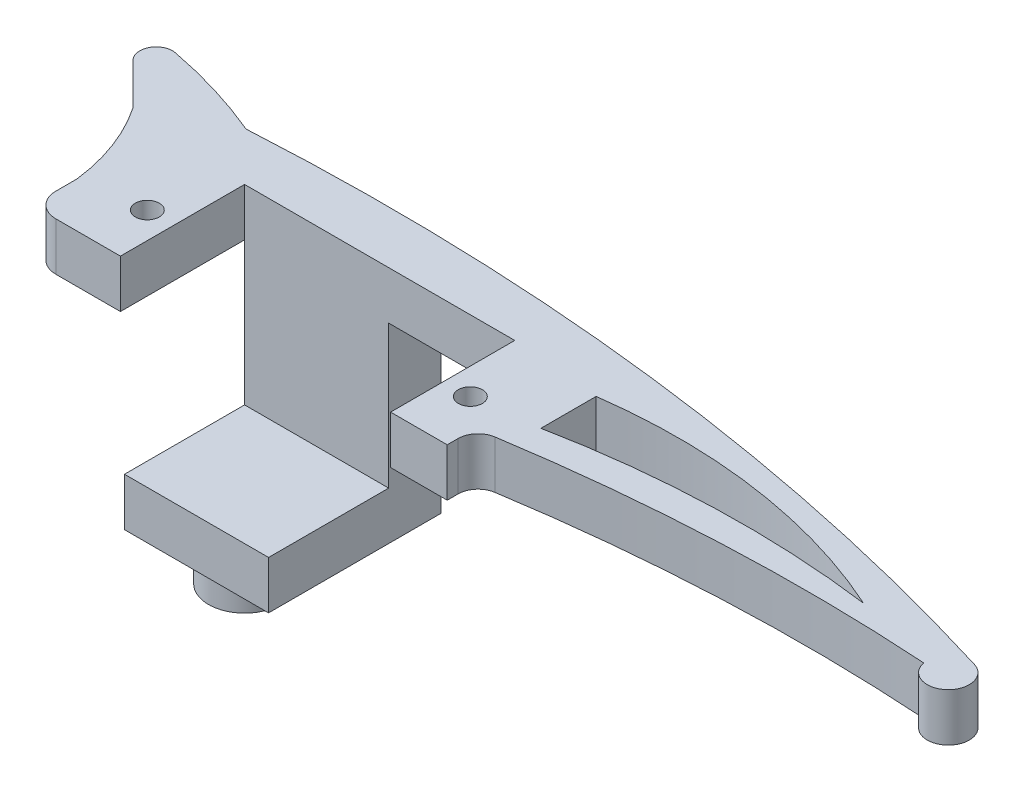
ISO-10303-21;
HEADER;
FILE_DESCRIPTION(('STEP AP214'),'2;1');
FILE_NAME('part.step','',(''),(''),'','','');
FILE_SCHEMA(('AUTOMOTIVE_DESIGN { 1 0 10303 214 1 1 1 1 }'));
ENDSEC;
DATA;
#1=APPLICATION_CONTEXT('core data for automotive mechanical design processes');
#2=APPLICATION_PROTOCOL_DEFINITION('international standard','automotive_design',2000,#1);
#3=PRODUCT_CONTEXT('',#1,'mechanical');
#4=PRODUCT('Part','Part','',(#3));
#5=PRODUCT_RELATED_PRODUCT_CATEGORY('part','',(#4));
#6=PRODUCT_DEFINITION_FORMATION('','',#4);
#7=PRODUCT_DEFINITION_CONTEXT('part definition',#1,'design');
#8=PRODUCT_DEFINITION('design','',#6,#7);
#9=PRODUCT_DEFINITION_SHAPE('','',#8);
#10=(LENGTH_UNIT() NAMED_UNIT(*) SI_UNIT(.MILLI.,.METRE.));
#11=(NAMED_UNIT(*) PLANE_ANGLE_UNIT() SI_UNIT($,.RADIAN.));
#12=(NAMED_UNIT(*) SI_UNIT($,.STERADIAN.) SOLID_ANGLE_UNIT());
#13=UNCERTAINTY_MEASURE_WITH_UNIT(LENGTH_MEASURE(1.E-05),#10,'distance_accuracy_value','');
#14=(GEOMETRIC_REPRESENTATION_CONTEXT(3) GLOBAL_UNCERTAINTY_ASSIGNED_CONTEXT((#13)) GLOBAL_UNIT_ASSIGNED_CONTEXT((#10,
#11,#12)) REPRESENTATION_CONTEXT('',''));
#15=CARTESIAN_POINT('',(0.,0.,0.));
#16=DIRECTION('',(0.,0.,1.));
#17=DIRECTION('',(1.,0.,0.));
#18=AXIS2_PLACEMENT_3D('',#15,#16,#17);
#19=CARTESIAN_POINT('',(14.,2.,-5.9));
#20=DIRECTION('',(0.,0.,-1.));
#21=DIRECTION('',(-1.,0.,0.));
#22=AXIS2_PLACEMENT_3D('',#19,#20,#21);
#23=PLANE('',#22);
#24=DIRECTION('',(-1.,0.,0.));
#25=VECTOR('',#24,1.);
#26=CARTESIAN_POINT('',(14.,-13.9,-5.9));
#27=LINE('',#26,#25);
#28=CARTESIAN_POINT('',(26.,-13.9,-5.9));
#29=VERTEX_POINT('',#28);
#30=CARTESIAN_POINT('',(14.,-13.9,-5.9));
#31=VERTEX_POINT('',#30);
#32=EDGE_CURVE('E235',#29,#31,#27,.T.);
#33=ORIENTED_EDGE('',*,*,#32,.F.);
#34=DIRECTION('',(0.,1.,0.));
#35=VECTOR('',#34,1.);
#36=CARTESIAN_POINT('',(26.,-17.9,-5.9));
#37=LINE('',#36,#35);
#38=CARTESIAN_POINT('',(26.,-2.,-5.9));
#39=VERTEX_POINT('',#38);
#40=EDGE_CURVE('E270',#29,#39,#37,.T.);
#41=ORIENTED_EDGE('',*,*,#40,.T.);
#42=DIRECTION('',(1.,0.,0.));
#43=VECTOR('',#42,1.);
#44=CARTESIAN_POINT('',(14.,-2.,-5.9));
#45=LINE('',#44,#43);
#46=CARTESIAN_POINT('',(36.5,-2.,-5.9));
#47=VERTEX_POINT('',#46);
#48=EDGE_CURVE('E379',#39,#47,#45,.T.);
#49=ORIENTED_EDGE('',*,*,#48,.T.);
#50=DIRECTION('',(0.,-1.,0.));
#51=VECTOR('',#50,1.);
#52=CARTESIAN_POINT('',(36.5,2.,-5.9));
#53=LINE('',#52,#51);
#54=CARTESIAN_POINT('',(36.5,2.,-5.9));
#55=VERTEX_POINT('',#54);
#56=EDGE_CURVE('E48',#55,#47,#53,.T.);
#57=ORIENTED_EDGE('',*,*,#56,.F.);
#58=DIRECTION('',(1.,0.,0.));
#59=VECTOR('',#58,1.);
#60=CARTESIAN_POINT('',(14.,2.,-5.9));
#61=LINE('',#60,#59);
#62=CARTESIAN_POINT('',(14.,2.,-5.9));
#63=VERTEX_POINT('',#62);
#64=EDGE_CURVE('E329',#63,#55,#61,.T.);
#65=ORIENTED_EDGE('',*,*,#64,.F.);
#66=DIRECTION('',(0.,-1.,0.));
#67=VECTOR('',#66,1.);
#68=CARTESIAN_POINT('',(14.,2.,-5.9));
#69=LINE('',#68,#67);
#70=CARTESIAN_POINT('',(14.,-2.,-5.9));
#71=VERTEX_POINT('',#70);
#72=EDGE_CURVE('E11',#63,#71,#69,.T.);
#73=ORIENTED_EDGE('',*,*,#72,.T.);
#74=DIRECTION('',(0.,1.,0.));
#75=VECTOR('',#74,1.);
#76=CARTESIAN_POINT('',(14.,-17.9,-5.9));
#77=LINE('',#76,#75);
#78=EDGE_CURVE('E267',#31,#71,#77,.T.);
#79=ORIENTED_EDGE('',*,*,#78,.F.);
#80=EDGE_LOOP('',(#33,#41,#49,#57,#65,#73,#79));
#81=FACE_BOUND('',#80,.T.);
#82=ADVANCED_FACE('F39',(#81),#23,.F.);
#83=CARTESIAN_POINT('',(8.62634024035574,-2.,2.4385181586324));
#84=DIRECTION('',(0.,-1.,0.));
#85=DIRECTION('',(0.,0.,-1.));
#86=AXIS2_PLACEMENT_3D('',#83,#84,#85);
#87=PLANE('',#86);
#88=DIRECTION('',(0.,0.,-1.));
#89=VECTOR('',#88,1.);
#90=CARTESIAN_POINT('',(14.,-2.,2.4385181586324));
#91=LINE('',#90,#89);
#92=CARTESIAN_POINT('',(14.,-2.,-10.1461044190017));
#93=VERTEX_POINT('',#92);
#94=EDGE_CURVE('E255',#71,#93,#91,.T.);
#95=ORIENTED_EDGE('',*,*,#94,.F.);
#96=DIRECTION('',(0.,0.,-1.));
#97=VECTOR('',#96,1.);
#98=CARTESIAN_POINT('',(14.,-2.,0.));
#99=LINE('',#98,#97);
#100=CARTESIAN_POINT('',(14.,-2.,4.4385181586324));
#101=VERTEX_POINT('',#100);
#102=EDGE_CURVE('E322',#101,#71,#99,.T.);
#103=ORIENTED_EDGE('',*,*,#102,.F.);
#104=DIRECTION('',(1.,0.,0.));
#105=VECTOR('',#104,1.);
#106=CARTESIAN_POINT('',(14.,-2.,4.4385181586324));
#107=LINE('',#106,#105);
#108=CARTESIAN_POINT('',(8.62634024035575,-2.,4.4385181586324));
#109=VERTEX_POINT('',#108);
#110=EDGE_CURVE('E330',#109,#101,#107,.T.);
#111=ORIENTED_EDGE('',*,*,#110,.F.);
#112=CARTESIAN_POINT('',(8.62634024035574,-2.,2.4385181586324));
#113=DIRECTION('',(0.,1.,0.));
#114=DIRECTION('',(0.,0.,-1.));
#115=AXIS2_PLACEMENT_3D('',#112,#113,#114);
#116=CIRCLE('',#115,2.);
#117=CARTESIAN_POINT('',(6.62634024035574,-2.,2.43851815863239));
#118=VERTEX_POINT('',#117);
#119=EDGE_CURVE('E418',#118,#109,#116,.T.);
#120=ORIENTED_EDGE('',*,*,#119,.F.);
#121=DIRECTION('',(0.,0.,1.));
#122=VECTOR('',#121,1.);
#123=CARTESIAN_POINT('',(6.62634024035574,-2.,2.43851815863239));
#124=LINE('',#123,#122);
#125=CARTESIAN_POINT('',(6.62634024035574,-2.,0.696918803145781));
#126=VERTEX_POINT('',#125);
#127=EDGE_CURVE('E415',#126,#118,#124,.T.);
#128=ORIENTED_EDGE('',*,*,#127,.F.);
#129=CARTESIAN_POINT('',(-10.1704841528173,-2.,2.72257085172816));
#130=DIRECTION('',(0.,-1.,0.));
#131=DIRECTION('',(0.,0.,-1.));
#132=AXIS2_PLACEMENT_3D('',#129,#130,#131);
#133=CIRCLE('',#132,16.9185275930566);
#134=CARTESIAN_POINT('',(3.82191689743255,-2.,-6.78791224672617));
#135=VERTEX_POINT('',#134);
#136=EDGE_CURVE('E412',#135,#126,#133,.T.);
#137=ORIENTED_EDGE('',*,*,#136,.F.);
#138=DIRECTION('',(0.707106781186548,0.,0.707106781186547));
#139=VECTOR('',#138,1.);
#140=CARTESIAN_POINT('',(0.399525233837649,-2.,-10.2103039103211));
#141=LINE('',#140,#139);
#142=CARTESIAN_POINT('',(0.399525233837648,-2.,-10.2103039103211));
#143=VERTEX_POINT('',#142);
#144=EDGE_CURVE('E409',#143,#135,#141,.T.);
#145=ORIENTED_EDGE('',*,*,#144,.F.);
#146=CARTESIAN_POINT('',(1.36406447187878,-2.,-11.1748431483622));
#147=DIRECTION('',(0.,1.,0.));
#148=DIRECTION('',(0.,0.,1.));
#149=AXIS2_PLACEMENT_3D('',#146,#147,#148);
#150=CIRCLE('',#149,1.36406447187879);
#151=CARTESIAN_POINT('',(1.62029316355011,-2.,-12.5146262431236));
#152=VERTEX_POINT('',#151);
#153=EDGE_CURVE('E406',#152,#143,#150,.T.);
#154=ORIENTED_EDGE('',*,*,#153,.F.);
#155=CARTESIAN_POINT('',(-6.28370304347102,-2.,28.8142367742464));
#156=DIRECTION('',(0.,1.,0.));
#157=DIRECTION('',(0.,0.,1.));
#158=AXIS2_PLACEMENT_3D('',#155,#156,#157);
#159=CIRCLE('',#158,42.0778810582132);
#160=CARTESIAN_POINT('',(10.0716883526537,-2.,-9.95494230693514));
#161=VERTEX_POINT('',#160);
#162=EDGE_CURVE('E403',#161,#152,#159,.T.);
#163=ORIENTED_EDGE('',*,*,#162,.F.);
#164=CARTESIAN_POINT('',(21.5542197661014,-2.,185.548621723486));
#165=DIRECTION('',(0.,1.,0.));
#166=DIRECTION('',(0.,0.,1.));
#167=AXIS2_PLACEMENT_3D('',#164,#165,#166);
#168=CIRCLE('',#167,195.840476092808);
#169=EDGE_CURVE('E55',#93,#161,#168,.T.);
#170=ORIENTED_EDGE('',*,*,#169,.F.);
#171=EDGE_LOOP('',(#95,#103,#111,#120,#128,#137,#145,#154,#163,#170));
#172=FACE_BOUND('',#171,.T.);
#173=CARTESIAN_POINT('',(11.8,-2.,0.));
#174=DIRECTION('',(0.,1.,0.));
#175=DIRECTION('',(0.,0.,1.));
#176=AXIS2_PLACEMENT_3D('',#173,#174,#175);
#177=CIRCLE('',#176,1.);
#178=CARTESIAN_POINT('',(11.8,-2.,1.));
#179=VERTEX_POINT('',#178);
#180=EDGE_CURVE('E314',#179,#179,#177,.T.);
#181=ORIENTED_EDGE('',*,*,#180,.T.);
#182=EDGE_LOOP('',(#181));
#183=FACE_BOUND('',#182,.T.);
#184=ADVANCED_FACE('F517',(#172,#183),#87,.T.);
#185=CARTESIAN_POINT('',(8.62634024035574,2.,2.4385181586324));
#186=DIRECTION('',(0.,-1.,0.));
#187=DIRECTION('',(0.,0.,-1.));
#188=AXIS2_PLACEMENT_3D('',#185,#186,#187);
#189=PLANE('',#188);
#190=CARTESIAN_POINT('',(38.7,2.,0.));
#191=DIRECTION('',(0.,1.,0.));
#192=DIRECTION('',(0.,0.,1.));
#193=AXIS2_PLACEMENT_3D('',#190,#191,#192);
#194=CIRCLE('',#193,0.999999999999998);
#195=CARTESIAN_POINT('',(38.7,2.,0.999999999999998));
#196=VERTEX_POINT('',#195);
#197=EDGE_CURVE('E310',#196,#196,#194,.T.);
#198=ORIENTED_EDGE('',*,*,#197,.F.);
#199=EDGE_LOOP('',(#198));
#200=FACE_BOUND('',#199,.T.);
#201=CARTESIAN_POINT('',(11.8,2.,0.));
#202=DIRECTION('',(0.,1.,0.));
#203=DIRECTION('',(0.,0.,1.));
#204=AXIS2_PLACEMENT_3D('',#201,#202,#203);
#205=CIRCLE('',#204,1.);
#206=CARTESIAN_POINT('',(11.8,2.,1.));
#207=VERTEX_POINT('',#206);
#208=EDGE_CURVE('E318',#207,#207,#205,.T.);
#209=ORIENTED_EDGE('',*,*,#208,.F.);
#210=EDGE_LOOP('',(#209));
#211=FACE_BOUND('',#210,.T.);
#212=DIRECTION('',(0.,0.,-1.));
#213=VECTOR('',#212,1.);
#214=CARTESIAN_POINT('',(14.,2.,0.));
#215=LINE('',#214,#213);
#216=CARTESIAN_POINT('',(14.,2.,4.4385181586324));
#217=VERTEX_POINT('',#216);
#218=EDGE_CURVE('E326',#217,#63,#215,.T.);
#219=ORIENTED_EDGE('',*,*,#218,.T.);
#220=ORIENTED_EDGE('',*,*,#64,.T.);
#221=DIRECTION('',(0.,0.,1.));
#222=VECTOR('',#221,1.);
#223=CARTESIAN_POINT('',(36.5,2.,-5.9));
#224=LINE('',#223,#222);
#225=CARTESIAN_POINT('',(36.5,2.,4.4385181586324));
#226=VERTEX_POINT('',#225);
#227=EDGE_CURVE('E333',#55,#226,#224,.T.);
#228=ORIENTED_EDGE('',*,*,#227,.T.);
#229=DIRECTION('',(1.,0.,0.));
#230=VECTOR('',#229,1.);
#231=CARTESIAN_POINT('',(36.5,2.,4.4385181586324));
#232=LINE('',#231,#230);
#233=CARTESIAN_POINT('',(41.2135196632889,2.,4.4385181586324));
#234=VERTEX_POINT('',#233);
#235=EDGE_CURVE('E336',#226,#234,#232,.T.);
#236=ORIENTED_EDGE('',*,*,#235,.T.);
#237=DIRECTION('',(0.,0.,-1.));
#238=VECTOR('',#237,1.);
#239=CARTESIAN_POINT('',(41.2135196632889,2.,4.4385181586324));
#240=LINE('',#239,#238);
#241=CARTESIAN_POINT('',(41.2135196632889,2.,3.53621429674051));
#242=VERTEX_POINT('',#241);
#243=EDGE_CURVE('E339',#234,#242,#240,.T.);
#244=ORIENTED_EDGE('',*,*,#243,.T.);
#245=CARTESIAN_POINT('',(42.8824091488573,2.,3.53621429674051));
#246=DIRECTION('',(0.,-1.,0.));
#247=DIRECTION('',(0.,0.,-1.));
#248=AXIS2_PLACEMENT_3D('',#245,#246,#247);
#249=CIRCLE('',#248,1.66888948556837);
#250=CARTESIAN_POINT('',(42.621822840626,2.,1.88779478369079));
#251=VERTEX_POINT('',#250);
#252=EDGE_CURVE('E342',#242,#251,#249,.T.);
#253=ORIENTED_EDGE('',*,*,#252,.T.);
#254=CARTESIAN_POINT('',(66.6949978674598,2.,154.170129663986));
#255=DIRECTION('',(0.,-1.,0.));
#256=DIRECTION('',(0.,0.,-1.));
#257=AXIS2_PLACEMENT_3D('',#254,#255,#256);
#258=CIRCLE('',#257,154.173367584895);
#259=CARTESIAN_POINT('',(76.7808257933976,2.,0.32701689154066));
#260=VERTEX_POINT('',#259);
#261=EDGE_CURVE('E345',#251,#260,#258,.T.);
#262=ORIENTED_EDGE('',*,*,#261,.T.);
#263=CARTESIAN_POINT('',(78.5,2.,0.));
#264=DIRECTION('',(0.,1.,0.));
#265=DIRECTION('',(0.,0.,1.));
#266=AXIS2_PLACEMENT_3D('',#263,#264,#265);
#267=CIRCLE('',#266,1.75);
#268=CARTESIAN_POINT('',(79.0134467049361,2.,-1.67298310845934));
#269=VERTEX_POINT('',#268);
#270=EDGE_CURVE('E348',#260,#269,#267,.T.);
#271=ORIENTED_EDGE('',*,*,#270,.T.);
#272=CARTESIAN_POINT('',(21.5542197661014,2.,185.548621723486));
#273=DIRECTION('',(0.,1.,0.));
#274=DIRECTION('',(0.,0.,1.));
#275=AXIS2_PLACEMENT_3D('',#272,#273,#274);
#276=CIRCLE('',#275,195.840476092808);
#277=CARTESIAN_POINT('',(10.0716883526537,2.,-9.95494230693514));
#278=VERTEX_POINT('',#277);
#279=EDGE_CURVE('E351',#269,#278,#276,.T.);
#280=ORIENTED_EDGE('',*,*,#279,.T.);
#281=CARTESIAN_POINT('',(-6.28370304347102,2.,28.8142367742464));
#282=DIRECTION('',(0.,1.,0.));
#283=DIRECTION('',(0.,0.,1.));
#284=AXIS2_PLACEMENT_3D('',#281,#282,#283);
#285=CIRCLE('',#284,42.0778810582132);
#286=CARTESIAN_POINT('',(1.62029316355011,2.,-12.5146262431236));
#287=VERTEX_POINT('',#286);
#288=EDGE_CURVE('E354',#278,#287,#285,.T.);
#289=ORIENTED_EDGE('',*,*,#288,.T.);
#290=CARTESIAN_POINT('',(1.36406447187878,2.,-11.1748431483622));
#291=DIRECTION('',(0.,1.,0.));
#292=DIRECTION('',(0.,0.,1.));
#293=AXIS2_PLACEMENT_3D('',#290,#291,#292);
#294=CIRCLE('',#293,1.36406447187879);
#295=CARTESIAN_POINT('',(0.399525233837648,2.,-10.2103039103211));
#296=VERTEX_POINT('',#295);
#297=EDGE_CURVE('E357',#287,#296,#294,.T.);
#298=ORIENTED_EDGE('',*,*,#297,.T.);
#299=DIRECTION('',(0.707106781186548,0.,0.707106781186547));
#300=VECTOR('',#299,1.);
#301=CARTESIAN_POINT('',(0.399525233837649,2.,-10.2103039103211));
#302=LINE('',#301,#300);
#303=CARTESIAN_POINT('',(3.82191689743255,2.,-6.78791224672617));
#304=VERTEX_POINT('',#303);
#305=EDGE_CURVE('E360',#296,#304,#302,.T.);
#306=ORIENTED_EDGE('',*,*,#305,.T.);
#307=CARTESIAN_POINT('',(-10.1704841528173,2.,2.72257085172816));
#308=DIRECTION('',(0.,-1.,0.));
#309=DIRECTION('',(0.,0.,-1.));
#310=AXIS2_PLACEMENT_3D('',#307,#308,#309);
#311=CIRCLE('',#310,16.9185275930566);
#312=CARTESIAN_POINT('',(6.62634024035574,2.,0.696918803145781));
#313=VERTEX_POINT('',#312);
#314=EDGE_CURVE('E363',#304,#313,#311,.T.);
#315=ORIENTED_EDGE('',*,*,#314,.T.);
#316=DIRECTION('',(0.,0.,1.));
#317=VECTOR('',#316,1.);
#318=CARTESIAN_POINT('',(6.62634024035574,2.,2.43851815863239));
#319=LINE('',#318,#317);
#320=CARTESIAN_POINT('',(6.62634024035574,2.,2.43851815863239));
#321=VERTEX_POINT('',#320);
#322=EDGE_CURVE('E366',#313,#321,#319,.T.);
#323=ORIENTED_EDGE('',*,*,#322,.T.);
#324=CARTESIAN_POINT('',(8.62634024035574,2.,2.4385181586324));
#325=DIRECTION('',(0.,1.,0.));
#326=DIRECTION('',(0.,0.,-1.));
#327=AXIS2_PLACEMENT_3D('',#324,#325,#326);
#328=CIRCLE('',#327,2.);
#329=CARTESIAN_POINT('',(8.62634024035575,2.,4.4385181586324));
#330=VERTEX_POINT('',#329);
#331=EDGE_CURVE('E369',#321,#330,#328,.T.);
#332=ORIENTED_EDGE('',*,*,#331,.T.);
#333=DIRECTION('',(1.,0.,0.));
#334=VECTOR('',#333,1.);
#335=CARTESIAN_POINT('',(14.,2.,4.4385181586324));
#336=LINE('',#335,#334);
#337=EDGE_CURVE('E372',#330,#217,#336,.T.);
#338=ORIENTED_EDGE('',*,*,#337,.T.);
#339=EDGE_LOOP('',(#219,#220,#228,#236,#244,#253,#262,#271,#280,#289,#298,#306,#315,#323,#332,#338));
#340=FACE_BOUND('',#339,.T.);
#341=CARTESIAN_POINT('',(50.3927536626238,2.,41.8430559351532));
#342=DIRECTION('',(0.,1.,0.));
#343=DIRECTION('',(0.,0.,1.));
#344=AXIS2_PLACEMENT_3D('',#341,#342,#343);
#345=CIRCLE('',#344,47.53522273895);
#346=CARTESIAN_POINT('',(69.981420933368,2.,-1.46839192101599));
#347=VERTEX_POINT('',#346);
#348=CARTESIAN_POINT('',(43.9242543366505,2.,-5.25));
#349=VERTEX_POINT('',#348);
#350=EDGE_CURVE('E277',#347,#349,#345,.T.);
#351=ORIENTED_EDGE('',*,*,#350,.F.);
#352=CARTESIAN_POINT('',(59.4329039404455,2.,77.9048055553327));
#353=DIRECTION('',(0.,-1.,0.));
#354=DIRECTION('',(0.,0.,-1.));
#355=AXIS2_PLACEMENT_3D('',#352,#353,#354);
#356=CIRCLE('',#355,80.071066487024);
#357=CARTESIAN_POINT('',(43.9242543366505,2.,-0.649999999999998));
#358=VERTEX_POINT('',#357);
#359=EDGE_CURVE('E285',#358,#347,#356,.T.);
#360=ORIENTED_EDGE('',*,*,#359,.F.);
#361=DIRECTION('',(0.,0.,1.));
#362=VECTOR('',#361,1.);
#363=CARTESIAN_POINT('',(43.9242543366505,2.,-5.25));
#364=LINE('',#363,#362);
#365=EDGE_CURVE('E280',#349,#358,#364,.T.);
#366=ORIENTED_EDGE('',*,*,#365,.F.);
#367=EDGE_LOOP('',(#351,#360,#366));
#368=FACE_BOUND('',#367,.T.);
#369=ADVANCED_FACE('F504',(#200,#211,#340,#368),#189,.F.);
#370=DIRECTION('',(0.,0.,1.));
#371=VECTOR('',#370,1.);
#372=CARTESIAN_POINT('',(26.,-2.,2.4385181586324));
#373=LINE('',#372,#371);
#374=CARTESIAN_POINT('',(26.,-2.,-10.2413859744802));
#375=VERTEX_POINT('',#374);
#376=EDGE_CURVE('E63',#375,#39,#373,.T.);
#377=ORIENTED_EDGE('',*,*,#376,.F.);
#378=CARTESIAN_POINT('',(79.0134467049361,-2.,-1.67298310845934));
#379=VERTEX_POINT('',#378);
#380=EDGE_CURVE('E400',#379,#375,#168,.T.);
#381=ORIENTED_EDGE('',*,*,#380,.F.);
#382=CARTESIAN_POINT('',(78.5,-2.,0.));
#383=DIRECTION('',(0.,1.,0.));
#384=DIRECTION('',(0.,0.,1.));
#385=AXIS2_PLACEMENT_3D('',#382,#383,#384);
#386=CIRCLE('',#385,1.75);
#387=CARTESIAN_POINT('',(76.7808257933976,-2.,0.32701689154066));
#388=VERTEX_POINT('',#387);
#389=EDGE_CURVE('E397',#388,#379,#386,.T.);
#390=ORIENTED_EDGE('',*,*,#389,.F.);
#391=CARTESIAN_POINT('',(66.6949978674598,-2.,154.170129663986));
#392=DIRECTION('',(0.,-1.,0.));
#393=DIRECTION('',(0.,0.,-1.));
#394=AXIS2_PLACEMENT_3D('',#391,#392,#393);
#395=CIRCLE('',#394,154.173367584895);
#396=CARTESIAN_POINT('',(42.621822840626,-2.,1.88779478369079));
#397=VERTEX_POINT('',#396);
#398=EDGE_CURVE('E394',#397,#388,#395,.T.);
#399=ORIENTED_EDGE('',*,*,#398,.F.);
#400=CARTESIAN_POINT('',(42.8824091488573,-2.,3.53621429674051));
#401=DIRECTION('',(0.,-1.,0.));
#402=DIRECTION('',(0.,0.,-1.));
#403=AXIS2_PLACEMENT_3D('',#400,#401,#402);
#404=CIRCLE('',#403,1.66888948556837);
#405=CARTESIAN_POINT('',(41.2135196632889,-2.,3.53621429674051));
#406=VERTEX_POINT('',#405);
#407=EDGE_CURVE('E391',#406,#397,#404,.T.);
#408=ORIENTED_EDGE('',*,*,#407,.F.);
#409=DIRECTION('',(0.,0.,-1.));
#410=VECTOR('',#409,1.);
#411=CARTESIAN_POINT('',(41.2135196632889,-2.,4.4385181586324));
#412=LINE('',#411,#410);
#413=CARTESIAN_POINT('',(41.2135196632889,-2.,4.4385181586324));
#414=VERTEX_POINT('',#413);
#415=EDGE_CURVE('E388',#414,#406,#412,.T.);
#416=ORIENTED_EDGE('',*,*,#415,.F.);
#417=DIRECTION('',(1.,0.,0.));
#418=VECTOR('',#417,1.);
#419=CARTESIAN_POINT('',(36.5,-2.,4.4385181586324));
#420=LINE('',#419,#418);
#421=CARTESIAN_POINT('',(36.5,-2.,4.4385181586324));
#422=VERTEX_POINT('',#421);
#423=EDGE_CURVE('E385',#422,#414,#420,.T.);
#424=ORIENTED_EDGE('',*,*,#423,.F.);
#425=DIRECTION('',(0.,0.,1.));
#426=VECTOR('',#425,1.);
#427=CARTESIAN_POINT('',(36.5,-2.,0.));
#428=LINE('',#427,#426);
#429=EDGE_CURVE('E382',#47,#422,#428,.T.);
#430=ORIENTED_EDGE('',*,*,#429,.F.);
#431=ORIENTED_EDGE('',*,*,#48,.F.);
#432=EDGE_LOOP('',(#377,#381,#390,#399,#408,#416,#424,#430,#431));
#433=FACE_BOUND('',#432,.T.);
#434=CARTESIAN_POINT('',(38.7,-2.,0.));
#435=DIRECTION('',(0.,1.,0.));
#436=DIRECTION('',(0.,0.,1.));
#437=AXIS2_PLACEMENT_3D('',#434,#435,#436);
#438=CIRCLE('',#437,0.999999999999998);
#439=CARTESIAN_POINT('',(38.7,-2.,0.999999999999998));
#440=VERTEX_POINT('',#439);
#441=EDGE_CURVE('E309',#440,#440,#438,.T.);
#442=ORIENTED_EDGE('',*,*,#441,.T.);
#443=EDGE_LOOP('',(#442));
#444=FACE_BOUND('',#443,.T.);
#445=CARTESIAN_POINT('',(59.4329039404455,-2.,77.9048055553327));
#446=DIRECTION('',(0.,-1.,0.));
#447=DIRECTION('',(0.,0.,-1.));
#448=AXIS2_PLACEMENT_3D('',#445,#446,#447);
#449=CIRCLE('',#448,80.071066487024);
#450=CARTESIAN_POINT('',(43.9242543366505,-2.,-0.65));
#451=VERTEX_POINT('',#450);
#452=CARTESIAN_POINT('',(69.981420933368,-2.,-1.46839192101599));
#453=VERTEX_POINT('',#452);
#454=EDGE_CURVE('E281',#451,#453,#449,.T.);
#455=ORIENTED_EDGE('',*,*,#454,.T.);
#456=CARTESIAN_POINT('',(50.3927536626238,-2.,41.8430559351532));
#457=DIRECTION('',(0.,1.,0.));
#458=DIRECTION('',(0.,0.,1.));
#459=AXIS2_PLACEMENT_3D('',#456,#457,#458);
#460=CIRCLE('',#459,47.53522273895);
#461=CARTESIAN_POINT('',(43.9242543366505,-2.,-5.25));
#462=VERTEX_POINT('',#461);
#463=EDGE_CURVE('E276',#453,#462,#460,.T.);
#464=ORIENTED_EDGE('',*,*,#463,.T.);
#465=DIRECTION('',(0.,0.,1.));
#466=VECTOR('',#465,1.);
#467=CARTESIAN_POINT('',(43.9242543366505,-2.,-5.25));
#468=LINE('',#467,#466);
#469=EDGE_CURVE('E292',#462,#451,#468,.T.);
#470=ORIENTED_EDGE('',*,*,#469,.T.);
#471=EDGE_LOOP('',(#455,#464,#470));
#472=FACE_BOUND('',#471,.T.);
#473=ADVANCED_FACE('F490',(#433,#444,#472),#87,.T.);
#474=CARTESIAN_POINT('',(14.,2.,0.));
#475=DIRECTION('',(-1.,0.,0.));
#476=DIRECTION('',(0.,0.,1.));
#477=AXIS2_PLACEMENT_3D('',#474,#475,#476);
#478=PLANE('',#477);
#479=ORIENTED_EDGE('',*,*,#102,.T.);
#480=ORIENTED_EDGE('',*,*,#72,.F.);
#481=ORIENTED_EDGE('',*,*,#218,.F.);
#482=DIRECTION('',(0.,-1.,0.));
#483=VECTOR('',#482,1.);
#484=CARTESIAN_POINT('',(14.,2.,4.4385181586324));
#485=LINE('',#484,#483);
#486=EDGE_CURVE('E375',#217,#101,#485,.T.);
#487=ORIENTED_EDGE('',*,*,#486,.T.);
#488=EDGE_LOOP('',(#479,#480,#481,#487));
#489=FACE_BOUND('',#488,.T.);
#490=ADVANCED_FACE('F41',(#489),#478,.F.);
#491=CARTESIAN_POINT('',(36.5,2.,0.));
#492=DIRECTION('',(1.,0.,0.));
#493=DIRECTION('',(0.,0.,-1.));
#494=AXIS2_PLACEMENT_3D('',#491,#492,#493);
#495=PLANE('',#494);
#496=ORIENTED_EDGE('',*,*,#429,.T.);
#497=DIRECTION('',(0.,-1.,0.));
#498=VECTOR('',#497,1.);
#499=CARTESIAN_POINT('',(36.5,2.,4.4385181586324));
#500=LINE('',#499,#498);
#501=EDGE_CURVE('E475',#226,#422,#500,.T.);
#502=ORIENTED_EDGE('',*,*,#501,.F.);
#503=ORIENTED_EDGE('',*,*,#227,.F.);
#504=ORIENTED_EDGE('',*,*,#56,.T.);
#505=EDGE_LOOP('',(#496,#502,#503,#504));
#506=FACE_BOUND('',#505,.T.);
#507=ADVANCED_FACE('F483',(#506),#495,.F.);
#508=CARTESIAN_POINT('',(36.5,2.,4.4385181586324));
#509=DIRECTION('',(0.,0.,-1.));
#510=DIRECTION('',(-1.,0.,0.));
#511=AXIS2_PLACEMENT_3D('',#508,#509,#510);
#512=PLANE('',#511);
#513=ORIENTED_EDGE('',*,*,#423,.T.);
#514=DIRECTION('',(0.,-1.,0.));
#515=VECTOR('',#514,1.);
#516=CARTESIAN_POINT('',(41.2135196632889,2.,4.4385181586324));
#517=LINE('',#516,#515);
#518=EDGE_CURVE('E471',#234,#414,#517,.T.);
#519=ORIENTED_EDGE('',*,*,#518,.F.);
#520=ORIENTED_EDGE('',*,*,#235,.F.);
#521=ORIENTED_EDGE('',*,*,#501,.T.);
#522=EDGE_LOOP('',(#513,#519,#520,#521));
#523=FACE_BOUND('',#522,.T.);
#524=ADVANCED_FACE('F496',(#523),#512,.F.);
#525=CARTESIAN_POINT('',(41.2135196632889,2.,4.4385181586324));
#526=DIRECTION('',(-1.,0.,0.));
#527=DIRECTION('',(0.,0.,1.));
#528=AXIS2_PLACEMENT_3D('',#525,#526,#527);
#529=PLANE('',#528);
#530=ORIENTED_EDGE('',*,*,#415,.T.);
#531=DIRECTION('',(0.,-1.,0.));
#532=VECTOR('',#531,1.);
#533=CARTESIAN_POINT('',(41.2135196632889,2.,3.53621429674051));
#534=LINE('',#533,#532);
#535=EDGE_CURVE('E467',#242,#406,#534,.T.);
#536=ORIENTED_EDGE('',*,*,#535,.F.);
#537=ORIENTED_EDGE('',*,*,#243,.F.);
#538=ORIENTED_EDGE('',*,*,#518,.T.);
#539=EDGE_LOOP('',(#530,#536,#537,#538));
#540=FACE_BOUND('',#539,.T.);
#541=ADVANCED_FACE('F500',(#540),#529,.F.);
#542=CARTESIAN_POINT('',(42.8824091488573,2.,3.53621429674051));
#543=DIRECTION('',(0.,-1.,0.));
#544=DIRECTION('',(0.,0.,-1.));
#545=AXIS2_PLACEMENT_3D('',#542,#543,#544);
#546=CYLINDRICAL_SURFACE('',#545,1.66888948556837);
#547=ORIENTED_EDGE('',*,*,#407,.T.);
#548=DIRECTION('',(0.,-1.,0.));
#549=VECTOR('',#548,1.);
#550=CARTESIAN_POINT('',(42.621822840626,2.,1.88779478369079));
#551=LINE('',#550,#549);
#552=EDGE_CURVE('E463',#251,#397,#551,.T.);
#553=ORIENTED_EDGE('',*,*,#552,.F.);
#554=ORIENTED_EDGE('',*,*,#252,.F.);
#555=ORIENTED_EDGE('',*,*,#535,.T.);
#556=EDGE_LOOP('',(#547,#553,#554,#555));
#557=FACE_BOUND('',#556,.T.);
#558=ADVANCED_FACE('F567',(#557),#546,.F.);
#559=CARTESIAN_POINT('',(66.6949978674598,2.,154.170129663986));
#560=DIRECTION('',(0.,-1.,0.));
#561=DIRECTION('',(0.,0.,-1.));
#562=AXIS2_PLACEMENT_3D('',#559,#560,#561);
#563=CYLINDRICAL_SURFACE('',#562,154.173367584895);
#564=ORIENTED_EDGE('',*,*,#398,.T.);
#565=DIRECTION('',(0.,-1.,0.));
#566=VECTOR('',#565,1.);
#567=CARTESIAN_POINT('',(76.7808257933976,2.,0.32701689154066));
#568=LINE('',#567,#566);
#569=EDGE_CURVE('E459',#260,#388,#568,.T.);
#570=ORIENTED_EDGE('',*,*,#569,.F.);
#571=ORIENTED_EDGE('',*,*,#261,.F.);
#572=ORIENTED_EDGE('',*,*,#552,.T.);
#573=EDGE_LOOP('',(#564,#570,#571,#572));
#574=FACE_BOUND('',#573,.T.);
#575=ADVANCED_FACE('F565',(#574),#563,.F.);
#576=CARTESIAN_POINT('',(78.5,2.,0.));
#577=DIRECTION('',(0.,-1.,0.));
#578=DIRECTION('',(0.,0.,-1.));
#579=AXIS2_PLACEMENT_3D('',#576,#577,#578);
#580=CYLINDRICAL_SURFACE('',#579,1.75);
#581=ORIENTED_EDGE('',*,*,#389,.T.);
#582=DIRECTION('',(0.,-1.,0.));
#583=VECTOR('',#582,1.);
#584=CARTESIAN_POINT('',(79.0134467049361,2.,-1.67298310845934));
#585=LINE('',#584,#583);
#586=EDGE_CURVE('E455',#269,#379,#585,.T.);
#587=ORIENTED_EDGE('',*,*,#586,.F.);
#588=ORIENTED_EDGE('',*,*,#270,.F.);
#589=ORIENTED_EDGE('',*,*,#569,.T.);
#590=EDGE_LOOP('',(#581,#587,#588,#589));
#591=FACE_BOUND('',#590,.T.);
#592=ADVANCED_FACE('F560',(#591),#580,.T.);
#593=CARTESIAN_POINT('',(21.5542197661014,2.,185.548621723486));
#594=DIRECTION('',(0.,-1.,0.));
#595=DIRECTION('',(0.,0.,-1.));
#596=AXIS2_PLACEMENT_3D('',#593,#594,#595);
#597=CYLINDRICAL_SURFACE('',#596,195.840476092808);
#598=ORIENTED_EDGE('',*,*,#380,.T.);
#599=DIRECTION('',(0.,1.,0.));
#600=VECTOR('',#599,1.);
#601=CARTESIAN_POINT('',(26.,-17.9,-10.2413859744797));
#602=LINE('',#601,#600);
#603=CARTESIAN_POINT('',(26.,-17.9,-10.2413859744797));
#604=VERTEX_POINT('',#603);
#605=EDGE_CURVE('E273',#604,#375,#602,.T.);
#606=ORIENTED_EDGE('',*,*,#605,.F.);
#607=CARTESIAN_POINT('',(21.5542197661014,-17.9,185.548621723486));
#608=DIRECTION('',(0.,-1.,0.));
#609=DIRECTION('',(0.,0.,-1.));
#610=AXIS2_PLACEMENT_3D('',#607,#608,#609);
#611=CIRCLE('',#610,195.840476092808);
#612=CARTESIAN_POINT('',(14.,-17.9,-10.1461044190011));
#613=VERTEX_POINT('',#612);
#614=EDGE_CURVE('E213',#613,#604,#611,.T.);
#615=ORIENTED_EDGE('',*,*,#614,.F.);
#616=DIRECTION('',(0.,1.,0.));
#617=VECTOR('',#616,1.);
#618=CARTESIAN_POINT('',(14.,-17.9,-10.1461044190011));
#619=LINE('',#618,#617);
#620=EDGE_CURVE('E259',#613,#93,#619,.T.);
#621=ORIENTED_EDGE('',*,*,#620,.T.);
#622=ORIENTED_EDGE('',*,*,#169,.T.);
#623=DIRECTION('',(0.,-1.,0.));
#624=VECTOR('',#623,1.);
#625=CARTESIAN_POINT('',(10.0716883526537,2.,-9.95494230693514));
#626=LINE('',#625,#624);
#627=EDGE_CURVE('E451',#278,#161,#626,.T.);
#628=ORIENTED_EDGE('',*,*,#627,.F.);
#629=ORIENTED_EDGE('',*,*,#279,.F.);
#630=ORIENTED_EDGE('',*,*,#586,.T.);
#631=EDGE_LOOP('',(#598,#606,#615,#621,#622,#628,#629,#630));
#632=FACE_BOUND('',#631,.T.);
#633=ADVANCED_FACE('F554',(#632),#597,.T.);
#634=CARTESIAN_POINT('',(-6.28370304347102,2.,28.8142367742464));
#635=DIRECTION('',(0.,-1.,0.));
#636=DIRECTION('',(0.,0.,-1.));
#637=AXIS2_PLACEMENT_3D('',#634,#635,#636);
#638=CYLINDRICAL_SURFACE('',#637,42.0778810582132);
#639=ORIENTED_EDGE('',*,*,#162,.T.);
#640=DIRECTION('',(0.,-1.,0.));
#641=VECTOR('',#640,1.);
#642=CARTESIAN_POINT('',(1.62029316355011,2.,-12.5146262431236));
#643=LINE('',#642,#641);
#644=EDGE_CURVE('E447',#287,#152,#643,.T.);
#645=ORIENTED_EDGE('',*,*,#644,.F.);
#646=ORIENTED_EDGE('',*,*,#288,.F.);
#647=ORIENTED_EDGE('',*,*,#627,.T.);
#648=EDGE_LOOP('',(#639,#645,#646,#647));
#649=FACE_BOUND('',#648,.T.);
#650=ADVANCED_FACE('F550',(#649),#638,.T.);
#651=CARTESIAN_POINT('',(1.36406447187878,2.,-11.1748431483622));
#652=DIRECTION('',(0.,-1.,0.));
#653=DIRECTION('',(0.,0.,-1.));
#654=AXIS2_PLACEMENT_3D('',#651,#652,#653);
#655=CYLINDRICAL_SURFACE('',#654,1.36406447187879);
#656=ORIENTED_EDGE('',*,*,#153,.T.);
#657=DIRECTION('',(0.,-1.,0.));
#658=VECTOR('',#657,1.);
#659=CARTESIAN_POINT('',(0.399525233837648,2.,-10.2103039103211));
#660=LINE('',#659,#658);
#661=EDGE_CURVE('E443',#296,#143,#660,.T.);
#662=ORIENTED_EDGE('',*,*,#661,.F.);
#663=ORIENTED_EDGE('',*,*,#297,.F.);
#664=ORIENTED_EDGE('',*,*,#644,.T.);
#665=EDGE_LOOP('',(#656,#662,#663,#664));
#666=FACE_BOUND('',#665,.T.);
#667=ADVANCED_FACE('F545',(#666),#655,.T.);
#668=CARTESIAN_POINT('',(0.399525233837649,2.,-10.2103039103211));
#669=DIRECTION('',(0.707106781186547,0.,-0.707106781186548));
#670=DIRECTION('',(-0.707106781186548,0.,-0.707106781186547));
#671=AXIS2_PLACEMENT_3D('',#668,#669,#670);
#672=PLANE('',#671);
#673=ORIENTED_EDGE('',*,*,#144,.T.);
#674=DIRECTION('',(0.,-1.,0.));
#675=VECTOR('',#674,1.);
#676=CARTESIAN_POINT('',(3.82191689743255,2.,-6.78791224672617));
#677=LINE('',#676,#675);
#678=EDGE_CURVE('E439',#304,#135,#677,.T.);
#679=ORIENTED_EDGE('',*,*,#678,.F.);
#680=ORIENTED_EDGE('',*,*,#305,.F.);
#681=ORIENTED_EDGE('',*,*,#661,.T.);
#682=EDGE_LOOP('',(#673,#679,#680,#681));
#683=FACE_BOUND('',#682,.T.);
#684=ADVANCED_FACE('F541',(#683),#672,.F.);
#685=CARTESIAN_POINT('',(-10.1704841528173,2.,2.72257085172816));
#686=DIRECTION('',(0.,-1.,0.));
#687=DIRECTION('',(0.,0.,-1.));
#688=AXIS2_PLACEMENT_3D('',#685,#686,#687);
#689=CYLINDRICAL_SURFACE('',#688,16.9185275930566);
#690=ORIENTED_EDGE('',*,*,#136,.T.);
#691=DIRECTION('',(0.,-1.,0.));
#692=VECTOR('',#691,1.);
#693=CARTESIAN_POINT('',(6.62634024035574,2.,0.696918803145781));
#694=LINE('',#693,#692);
#695=EDGE_CURVE('E435',#313,#126,#694,.T.);
#696=ORIENTED_EDGE('',*,*,#695,.F.);
#697=ORIENTED_EDGE('',*,*,#314,.F.);
#698=ORIENTED_EDGE('',*,*,#678,.T.);
#699=EDGE_LOOP('',(#690,#696,#697,#698));
#700=FACE_BOUND('',#699,.T.);
#701=ADVANCED_FACE('F537',(#700),#689,.F.);
#702=CARTESIAN_POINT('',(6.62634024035574,2.,2.43851815863239));
#703=DIRECTION('',(1.,0.,0.));
#704=DIRECTION('',(0.,0.,-1.));
#705=AXIS2_PLACEMENT_3D('',#702,#703,#704);
#706=PLANE('',#705);
#707=ORIENTED_EDGE('',*,*,#127,.T.);
#708=DIRECTION('',(0.,-1.,0.));
#709=VECTOR('',#708,1.);
#710=CARTESIAN_POINT('',(6.62634024035574,2.,2.43851815863239));
#711=LINE('',#710,#709);
#712=EDGE_CURVE('E431',#321,#118,#711,.T.);
#713=ORIENTED_EDGE('',*,*,#712,.F.);
#714=ORIENTED_EDGE('',*,*,#322,.F.);
#715=ORIENTED_EDGE('',*,*,#695,.T.);
#716=EDGE_LOOP('',(#707,#713,#714,#715));
#717=FACE_BOUND('',#716,.T.);
#718=ADVANCED_FACE('F532',(#717),#706,.F.);
#719=CARTESIAN_POINT('',(8.62634024035574,2.,2.4385181586324));
#720=DIRECTION('',(0.,-1.,0.));
#721=DIRECTION('',(0.,0.,-1.));
#722=AXIS2_PLACEMENT_3D('',#719,#720,#721);
#723=CYLINDRICAL_SURFACE('',#722,2.);
#724=ORIENTED_EDGE('',*,*,#119,.T.);
#725=DIRECTION('',(0.,-1.,0.));
#726=VECTOR('',#725,1.);
#727=CARTESIAN_POINT('',(8.62634024035575,2.,4.4385181586324));
#728=LINE('',#727,#726);
#729=EDGE_CURVE('E427',#330,#109,#728,.T.);
#730=ORIENTED_EDGE('',*,*,#729,.F.);
#731=ORIENTED_EDGE('',*,*,#331,.F.);
#732=ORIENTED_EDGE('',*,*,#712,.T.);
#733=EDGE_LOOP('',(#724,#730,#731,#732));
#734=FACE_BOUND('',#733,.T.);
#735=ADVANCED_FACE('F526',(#734),#723,.T.);
#736=CARTESIAN_POINT('',(14.,2.,4.4385181586324));
#737=DIRECTION('',(0.,0.,-1.));
#738=DIRECTION('',(-1.,0.,0.));
#739=AXIS2_PLACEMENT_3D('',#736,#737,#738);
#740=PLANE('',#739);
#741=ORIENTED_EDGE('',*,*,#110,.T.);
#742=ORIENTED_EDGE('',*,*,#486,.F.);
#743=ORIENTED_EDGE('',*,*,#337,.F.);
#744=ORIENTED_EDGE('',*,*,#729,.T.);
#745=EDGE_LOOP('',(#741,#742,#743,#744));
#746=FACE_BOUND('',#745,.T.);
#747=ADVANCED_FACE('F522',(#746),#740,.F.);
#748=CARTESIAN_POINT('',(11.8,2.,0.));
#749=DIRECTION('',(0.,-1.,0.));
#750=DIRECTION('',(0.,0.,-1.));
#751=AXIS2_PLACEMENT_3D('',#748,#749,#750);
#752=CYLINDRICAL_SURFACE('',#751,1.);
#753=ORIENTED_EDGE('',*,*,#208,.T.);
#754=EDGE_LOOP('',(#753));
#755=FACE_BOUND('',#754,.T.);
#756=ORIENTED_EDGE('',*,*,#180,.F.);
#757=EDGE_LOOP('',(#756));
#758=FACE_BOUND('',#757,.T.);
#759=ADVANCED_FACE('F671',(#755,#758),#752,.F.);
#760=CARTESIAN_POINT('',(38.7,2.,0.));
#761=DIRECTION('',(0.,-1.,0.));
#762=DIRECTION('',(0.,0.,-1.));
#763=AXIS2_PLACEMENT_3D('',#760,#761,#762);
#764=CYLINDRICAL_SURFACE('',#763,0.999999999999998);
#765=ORIENTED_EDGE('',*,*,#197,.T.);
#766=EDGE_LOOP('',(#765));
#767=FACE_BOUND('',#766,.T.);
#768=ORIENTED_EDGE('',*,*,#441,.F.);
#769=EDGE_LOOP('',(#768));
#770=FACE_BOUND('',#769,.T.);
#771=ADVANCED_FACE('F680',(#767,#770),#764,.F.);
#772=CARTESIAN_POINT('',(50.3927536626238,2.,41.8430559351532));
#773=DIRECTION('',(0.,-1.,0.));
#774=DIRECTION('',(0.,0.,-1.));
#775=AXIS2_PLACEMENT_3D('',#772,#773,#774);
#776=CYLINDRICAL_SURFACE('',#775,47.53522273895);
#777=ORIENTED_EDGE('',*,*,#463,.F.);
#778=DIRECTION('',(0.,-1.,0.));
#779=VECTOR('',#778,1.);
#780=CARTESIAN_POINT('',(69.981420933368,2.,-1.46839192101599));
#781=LINE('',#780,#779);
#782=EDGE_CURVE('E288',#347,#453,#781,.T.);
#783=ORIENTED_EDGE('',*,*,#782,.F.);
#784=ORIENTED_EDGE('',*,*,#350,.T.);
#785=DIRECTION('',(0.,-1.,0.));
#786=VECTOR('',#785,1.);
#787=CARTESIAN_POINT('',(43.9242543366505,2.,-5.25));
#788=LINE('',#787,#786);
#789=EDGE_CURVE('E305',#349,#462,#788,.T.);
#790=ORIENTED_EDGE('',*,*,#789,.T.);
#791=EDGE_LOOP('',(#777,#783,#784,#790));
#792=FACE_BOUND('',#791,.T.);
#793=ADVANCED_FACE('F690',(#792),#776,.F.);
#794=CARTESIAN_POINT('',(43.9242543366505,2.,-5.25));
#795=DIRECTION('',(1.,0.,0.));
#796=DIRECTION('',(0.,0.,-1.));
#797=AXIS2_PLACEMENT_3D('',#794,#795,#796);
#798=PLANE('',#797);
#799=ORIENTED_EDGE('',*,*,#469,.F.);
#800=ORIENTED_EDGE('',*,*,#789,.F.);
#801=ORIENTED_EDGE('',*,*,#365,.T.);
#802=DIRECTION('',(0.,-1.,0.));
#803=VECTOR('',#802,1.);
#804=CARTESIAN_POINT('',(43.9242543366505,2.,-0.65));
#805=LINE('',#804,#803);
#806=EDGE_CURVE('E302',#358,#451,#805,.T.);
#807=ORIENTED_EDGE('',*,*,#806,.T.);
#808=EDGE_LOOP('',(#799,#800,#801,#807));
#809=FACE_BOUND('',#808,.T.);
#810=ADVANCED_FACE('F700',(#809),#798,.T.);
#811=CARTESIAN_POINT('',(59.4329039404455,2.,77.9048055553327));
#812=DIRECTION('',(0.,-1.,0.));
#813=DIRECTION('',(0.,0.,-1.));
#814=AXIS2_PLACEMENT_3D('',#811,#812,#813);
#815=CYLINDRICAL_SURFACE('',#814,80.071066487024);
#816=ORIENTED_EDGE('',*,*,#454,.F.);
#817=ORIENTED_EDGE('',*,*,#806,.F.);
#818=ORIENTED_EDGE('',*,*,#359,.T.);
#819=ORIENTED_EDGE('',*,*,#782,.T.);
#820=EDGE_LOOP('',(#816,#817,#818,#819));
#821=FACE_BOUND('',#820,.T.);
#822=ADVANCED_FACE('F710',(#821),#815,.T.);
#823=CARTESIAN_POINT('',(26.,-17.9,2.4385181586324));
#824=DIRECTION('',(-1.,0.,0.));
#825=DIRECTION('',(0.,0.,1.));
#826=AXIS2_PLACEMENT_3D('',#823,#824,#825);
#827=PLANE('',#826);
#828=ORIENTED_EDGE('',*,*,#376,.T.);
#829=ORIENTED_EDGE('',*,*,#40,.F.);
#830=DIRECTION('',(0.,0.,-1.));
#831=VECTOR('',#830,1.);
#832=CARTESIAN_POINT('',(26.,-13.9,4.1));
#833=LINE('',#832,#831);
#834=CARTESIAN_POINT('',(26.,-13.9,4.1));
#835=VERTEX_POINT('',#834);
#836=EDGE_CURVE('E224',#835,#29,#833,.T.);
#837=ORIENTED_EDGE('',*,*,#836,.F.);
#838=DIRECTION('',(0.,1.,0.));
#839=VECTOR('',#838,1.);
#840=CARTESIAN_POINT('',(26.,-17.9,4.1));
#841=LINE('',#840,#839);
#842=CARTESIAN_POINT('',(26.,-17.9,4.1));
#843=VERTEX_POINT('',#842);
#844=EDGE_CURVE('E221',#843,#835,#841,.T.);
#845=ORIENTED_EDGE('',*,*,#844,.F.);
#846=DIRECTION('',(0.,0.,1.));
#847=VECTOR('',#846,1.);
#848=CARTESIAN_POINT('',(26.,-17.9,2.4385181586324));
#849=LINE('',#848,#847);
#850=EDGE_CURVE('E207',#604,#843,#849,.T.);
#851=ORIENTED_EDGE('',*,*,#850,.F.);
#852=ORIENTED_EDGE('',*,*,#605,.T.);
#853=EDGE_LOOP('',(#828,#829,#837,#845,#851,#852));
#854=FACE_BOUND('',#853,.T.);
#855=ADVANCED_FACE('F222',(#854),#827,.F.);
#856=CARTESIAN_POINT('',(14.,-17.9,2.4385181586324));
#857=DIRECTION('',(1.,0.,0.));
#858=DIRECTION('',(0.,0.,-1.));
#859=AXIS2_PLACEMENT_3D('',#856,#857,#858);
#860=PLANE('',#859);
#861=ORIENTED_EDGE('',*,*,#94,.T.);
#862=ORIENTED_EDGE('',*,*,#620,.F.);
#863=DIRECTION('',(0.,0.,-1.));
#864=VECTOR('',#863,1.);
#865=CARTESIAN_POINT('',(14.,-17.9,2.4385181586324));
#866=LINE('',#865,#864);
#867=CARTESIAN_POINT('',(14.,-17.9,4.1));
#868=VERTEX_POINT('',#867);
#869=EDGE_CURVE('E218',#868,#613,#866,.T.);
#870=ORIENTED_EDGE('',*,*,#869,.F.);
#871=DIRECTION('',(0.,-1.,0.));
#872=VECTOR('',#871,1.);
#873=CARTESIAN_POINT('',(14.,-13.9,4.1));
#874=LINE('',#873,#872);
#875=CARTESIAN_POINT('',(14.,-13.9,4.1));
#876=VERTEX_POINT('',#875);
#877=EDGE_CURVE('E233',#876,#868,#874,.T.);
#878=ORIENTED_EDGE('',*,*,#877,.F.);
#879=DIRECTION('',(0.,0.,-1.));
#880=VECTOR('',#879,1.);
#881=CARTESIAN_POINT('',(14.,-13.9,4.1));
#882=LINE('',#881,#880);
#883=EDGE_CURVE('E247',#876,#31,#882,.T.);
#884=ORIENTED_EDGE('',*,*,#883,.T.);
#885=ORIENTED_EDGE('',*,*,#78,.T.);
#886=EDGE_LOOP('',(#861,#862,#870,#878,#884,#885));
#887=FACE_BOUND('',#886,.T.);
#888=ADVANCED_FACE('F514',(#887),#860,.F.);
#889=CARTESIAN_POINT('',(21.5542197661014,-17.9,185.548621723486));
#890=DIRECTION('',(0.,-1.,0.));
#891=DIRECTION('',(0.,0.,-1.));
#892=AXIS2_PLACEMENT_3D('',#889,#890,#891);
#893=PLANE('',#892);
#894=CARTESIAN_POINT('',(19.9,-17.9,0.));
#895=DIRECTION('',(0.,-1.,0.));
#896=DIRECTION('',(0.,0.,-1.));
#897=AXIS2_PLACEMENT_3D('',#894,#895,#896);
#898=CIRCLE('',#897,3.);
#899=CARTESIAN_POINT('',(19.9,-17.9,-3.));
#900=VERTEX_POINT('',#899);
#901=EDGE_CURVE('E241',#900,#900,#898,.T.);
#902=ORIENTED_EDGE('',*,*,#901,.F.);
#903=EDGE_LOOP('',(#902));
#904=FACE_BOUND('',#903,.T.);
#905=ORIENTED_EDGE('',*,*,#614,.T.);
#906=ORIENTED_EDGE('',*,*,#850,.T.);
#907=DIRECTION('',(1.,0.,0.));
#908=VECTOR('',#907,1.);
#909=CARTESIAN_POINT('',(14.,-17.9,4.1));
#910=LINE('',#909,#908);
#911=EDGE_CURVE('E211',#868,#843,#910,.T.);
#912=ORIENTED_EDGE('',*,*,#911,.F.);
#913=ORIENTED_EDGE('',*,*,#869,.T.);
#914=EDGE_LOOP('',(#905,#906,#912,#913));
#915=FACE_BOUND('',#914,.T.);
#916=ADVANCED_FACE('F209',(#904,#915),#893,.T.);
#917=CARTESIAN_POINT('',(14.,-13.9,4.1));
#918=DIRECTION('',(0.,-1.,0.));
#919=DIRECTION('',(0.,0.,-1.));
#920=AXIS2_PLACEMENT_3D('',#917,#918,#919);
#921=PLANE('',#920);
#922=ORIENTED_EDGE('',*,*,#32,.T.);
#923=ORIENTED_EDGE('',*,*,#883,.F.);
#924=DIRECTION('',(-1.,0.,0.));
#925=VECTOR('',#924,1.);
#926=CARTESIAN_POINT('',(14.,-13.9,4.1));
#927=LINE('',#926,#925);
#928=EDGE_CURVE('E228',#835,#876,#927,.T.);
#929=ORIENTED_EDGE('',*,*,#928,.F.);
#930=ORIENTED_EDGE('',*,*,#836,.T.);
#931=EDGE_LOOP('',(#922,#923,#929,#930));
#932=FACE_BOUND('',#931,.T.);
#933=ADVANCED_FACE('F780',(#932),#921,.F.);
#934=CARTESIAN_POINT('',(0.,0.,4.1));
#935=DIRECTION('',(0.,0.,1.));
#936=DIRECTION('',(1.,0.,0.));
#937=AXIS2_PLACEMENT_3D('',#934,#935,#936);
#938=PLANE('',#937);
#939=ORIENTED_EDGE('',*,*,#911,.T.);
#940=ORIENTED_EDGE('',*,*,#844,.T.);
#941=ORIENTED_EDGE('',*,*,#928,.T.);
#942=ORIENTED_EDGE('',*,*,#877,.T.);
#943=EDGE_LOOP('',(#939,#940,#941,#942));
#944=FACE_BOUND('',#943,.T.);
#945=ADVANCED_FACE('F231',(#944),#938,.T.);
#946=CARTESIAN_POINT('',(19.9,-20.9,0.));
#947=DIRECTION('',(0.,1.,0.));
#948=DIRECTION('',(0.,0.,1.));
#949=AXIS2_PLACEMENT_3D('',#946,#947,#948);
#950=CYLINDRICAL_SURFACE('',#949,3.);
#951=CARTESIAN_POINT('',(19.9,-20.9,0.));
#952=DIRECTION('',(0.,-1.,0.));
#953=DIRECTION('',(0.,0.,-1.));
#954=AXIS2_PLACEMENT_3D('',#951,#952,#953);
#955=CIRCLE('',#954,3.);
#956=CARTESIAN_POINT('',(19.9,-20.9,-3.));
#957=VERTEX_POINT('',#956);
#958=EDGE_CURVE('E238',#957,#957,#955,.T.);
#959=ORIENTED_EDGE('',*,*,#958,.F.);
#960=EDGE_LOOP('',(#959));
#961=FACE_BOUND('',#960,.T.);
#962=ORIENTED_EDGE('',*,*,#901,.T.);
#963=EDGE_LOOP('',(#962));
#964=FACE_BOUND('',#963,.T.);
#965=ADVANCED_FACE('F794',(#961,#964),#950,.T.);
#966=CARTESIAN_POINT('',(19.9,-20.9,0.));
#967=DIRECTION('',(0.,-1.,0.));
#968=DIRECTION('',(0.,0.,-1.));
#969=AXIS2_PLACEMENT_3D('',#966,#967,#968);
#970=PLANE('',#969);
#971=ORIENTED_EDGE('',*,*,#958,.T.);
#972=EDGE_LOOP('',(#971));
#973=FACE_BOUND('',#972,.T.);
#974=ADVANCED_FACE('F811',(#973),#970,.T.);
#975=CLOSED_SHELL('',(#82,#184,#369,#473,#490,#507,#524,#541,#558,#575,#592,#633,#650,#667,#684,
#701,#718,#735,#747,#759,#771,#793,#810,#822,#855,#888,#916,#933,#945,#965,#974));
#976=MANIFOLD_SOLID_BREP('B2',#975);
#977=ADVANCED_BREP_SHAPE_REPRESENTATION('',(#18,#976),#14);
#978=SHAPE_DEFINITION_REPRESENTATION(#9,#977);
ENDSEC;
END-ISO-10303-21;
